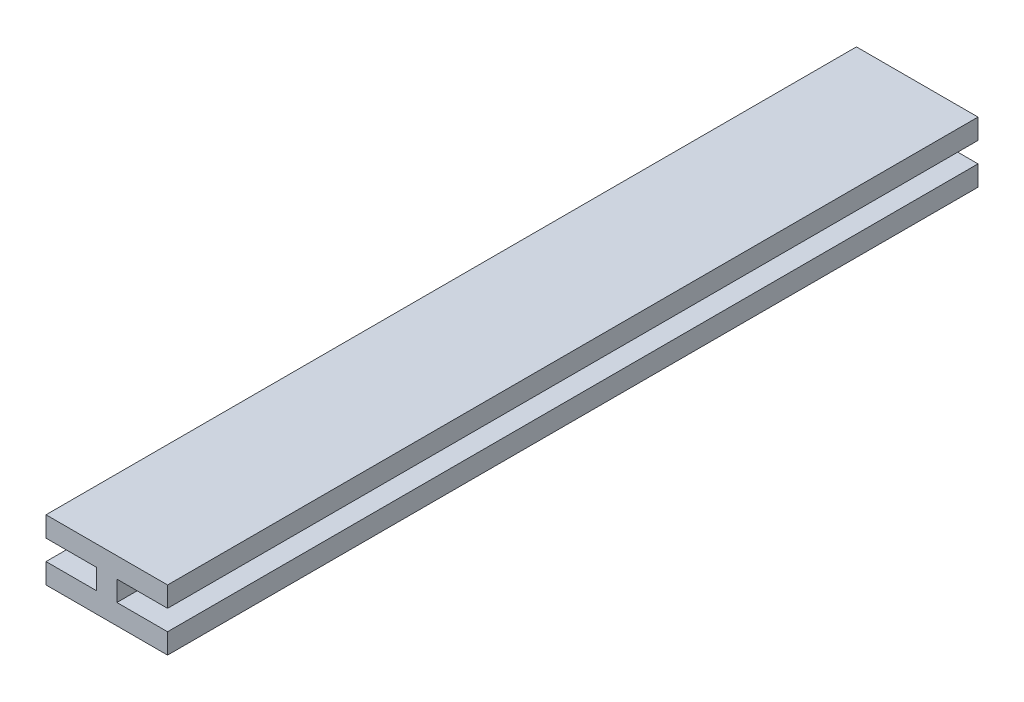
ISO-10303-21;
HEADER;
FILE_DESCRIPTION(('STEP AP214'),'2;1');
FILE_NAME('part.step','',(''),(''),'','','');
FILE_SCHEMA(('AUTOMOTIVE_DESIGN { 1 0 10303 214 1 1 1 1 }'));
ENDSEC;
DATA;
#1=APPLICATION_CONTEXT('core data for automotive mechanical design processes');
#2=APPLICATION_PROTOCOL_DEFINITION('international standard','automotive_design',2000,#1);
#3=PRODUCT_CONTEXT('',#1,'mechanical');
#4=PRODUCT('Part','Part','',(#3));
#5=PRODUCT_RELATED_PRODUCT_CATEGORY('part','',(#4));
#6=PRODUCT_DEFINITION_FORMATION('','',#4);
#7=PRODUCT_DEFINITION_CONTEXT('part definition',#1,'design');
#8=PRODUCT_DEFINITION('design','',#6,#7);
#9=PRODUCT_DEFINITION_SHAPE('','',#8);
#10=(LENGTH_UNIT() NAMED_UNIT(*) SI_UNIT(.MILLI.,.METRE.));
#11=(NAMED_UNIT(*) PLANE_ANGLE_UNIT() SI_UNIT($,.RADIAN.));
#12=(NAMED_UNIT(*) SI_UNIT($,.STERADIAN.) SOLID_ANGLE_UNIT());
#13=UNCERTAINTY_MEASURE_WITH_UNIT(LENGTH_MEASURE(1.E-05),#10,'distance_accuracy_value','');
#14=(GEOMETRIC_REPRESENTATION_CONTEXT(3) GLOBAL_UNCERTAINTY_ASSIGNED_CONTEXT((#13)) GLOBAL_UNIT_ASSIGNED_CONTEXT((#10,
#11,#12)) REPRESENTATION_CONTEXT('',''));
#15=CARTESIAN_POINT('',(0.,0.,0.));
#16=DIRECTION('',(0.,0.,1.));
#17=DIRECTION('',(1.,0.,0.));
#18=AXIS2_PLACEMENT_3D('',#15,#16,#17);
#19=CARTESIAN_POINT('',(0.,3.,0.));
#20=DIRECTION('',(0.,1.,0.));
#21=DIRECTION('',(0.,0.,1.));
#22=AXIS2_PLACEMENT_3D('',#19,#20,#21);
#23=PLANE('',#22);
#24=DIRECTION('',(0.,0.,1.));
#25=VECTOR('',#24,1.);
#26=CARTESIAN_POINT('',(-1.5,3.,60.));
#27=LINE('',#26,#25);
#28=CARTESIAN_POINT('',(-1.5,3.,-60.));
#29=VERTEX_POINT('',#28);
#30=CARTESIAN_POINT('',(-1.5,3.,60.));
#31=VERTEX_POINT('',#30);
#32=EDGE_CURVE('E153',#29,#31,#27,.T.);
#33=ORIENTED_EDGE('',*,*,#32,.F.);
#34=DIRECTION('',(-1.,0.,0.));
#35=VECTOR('',#34,1.);
#36=CARTESIAN_POINT('',(9.,3.,-60.));
#37=LINE('',#36,#35);
#38=CARTESIAN_POINT('',(-9.,3.,-60.));
#39=VERTEX_POINT('',#38);
#40=EDGE_CURVE('E248',#29,#39,#37,.T.);
#41=ORIENTED_EDGE('',*,*,#40,.T.);
#42=DIRECTION('',(0.,0.,-1.));
#43=VECTOR('',#42,1.);
#44=CARTESIAN_POINT('',(-9.,3.,60.));
#45=LINE('',#44,#43);
#46=CARTESIAN_POINT('',(-9.,3.,60.));
#47=VERTEX_POINT('',#46);
#48=EDGE_CURVE('E224',#47,#39,#45,.T.);
#49=ORIENTED_EDGE('',*,*,#48,.F.);
#50=DIRECTION('',(-1.,0.,0.));
#51=VECTOR('',#50,1.);
#52=CARTESIAN_POINT('',(9.,3.,60.));
#53=LINE('',#52,#51);
#54=EDGE_CURVE('E51',#31,#47,#53,.T.);
#55=ORIENTED_EDGE('',*,*,#54,.F.);
#56=EDGE_LOOP('',(#33,#41,#49,#55));
#57=FACE_BOUND('',#56,.T.);
#58=ADVANCED_FACE('F33',(#57),#23,.T.);
#59=CARTESIAN_POINT('',(9.,3.,60.));
#60=DIRECTION('',(-1.,0.,0.));
#61=DIRECTION('',(0.,0.,1.));
#62=AXIS2_PLACEMENT_3D('',#59,#60,#61);
#63=PLANE('',#62);
#64=DIRECTION('',(0.,0.,-1.));
#65=VECTOR('',#64,1.);
#66=CARTESIAN_POINT('',(9.,0.,60.));
#67=LINE('',#66,#65);
#68=CARTESIAN_POINT('',(9.,0.,60.));
#69=VERTEX_POINT('',#68);
#70=CARTESIAN_POINT('',(9.,0.,-60.));
#71=VERTEX_POINT('',#70);
#72=EDGE_CURVE('E212',#69,#71,#67,.T.);
#73=ORIENTED_EDGE('',*,*,#72,.T.);
#74=DIRECTION('',(0.,-1.,0.));
#75=VECTOR('',#74,1.);
#76=CARTESIAN_POINT('',(9.,3.,-60.));
#77=LINE('',#76,#75);
#78=CARTESIAN_POINT('',(9.,3.,-60.));
#79=VERTEX_POINT('',#78);
#80=EDGE_CURVE('E11',#79,#71,#77,.T.);
#81=ORIENTED_EDGE('',*,*,#80,.F.);
#82=DIRECTION('',(0.,0.,-1.));
#83=VECTOR('',#82,1.);
#84=CARTESIAN_POINT('',(9.,3.,60.));
#85=LINE('',#84,#83);
#86=CARTESIAN_POINT('',(9.,3.,60.));
#87=VERTEX_POINT('',#86);
#88=EDGE_CURVE('E241',#87,#79,#85,.T.);
#89=ORIENTED_EDGE('',*,*,#88,.F.);
#90=DIRECTION('',(0.,-1.,0.));
#91=VECTOR('',#90,1.);
#92=CARTESIAN_POINT('',(9.,3.,60.));
#93=LINE('',#92,#91);
#94=EDGE_CURVE('E242',#87,#69,#93,.T.);
#95=ORIENTED_EDGE('',*,*,#94,.T.);
#96=EDGE_LOOP('',(#73,#81,#89,#95));
#97=FACE_BOUND('',#96,.T.);
#98=ADVANCED_FACE('F35',(#97),#63,.F.);
#99=CARTESIAN_POINT('',(9.,3.,-60.));
#100=DIRECTION('',(0.,0.,1.));
#101=DIRECTION('',(1.,0.,0.));
#102=AXIS2_PLACEMENT_3D('',#99,#100,#101);
#103=PLANE('',#102);
#104=DIRECTION('',(-1.,0.,0.));
#105=VECTOR('',#104,1.);
#106=CARTESIAN_POINT('',(9.,0.,-60.));
#107=LINE('',#106,#105);
#108=CARTESIAN_POINT('',(-9.,0.,-60.));
#109=VERTEX_POINT('',#108);
#110=EDGE_CURVE('E233',#71,#109,#107,.T.);
#111=ORIENTED_EDGE('',*,*,#110,.T.);
#112=DIRECTION('',(0.,-1.,0.));
#113=VECTOR('',#112,1.);
#114=CARTESIAN_POINT('',(-9.,3.,-60.));
#115=LINE('',#114,#113);
#116=EDGE_CURVE('E43',#39,#109,#115,.T.);
#117=ORIENTED_EDGE('',*,*,#116,.F.);
#118=ORIENTED_EDGE('',*,*,#40,.F.);
#119=DIRECTION('',(0.,-1.,0.));
#120=VECTOR('',#119,1.);
#121=CARTESIAN_POINT('',(-1.5,6.,-60.));
#122=LINE('',#121,#120);
#123=CARTESIAN_POINT('',(-1.5,6.,-60.));
#124=VERTEX_POINT('',#123);
#125=EDGE_CURVE('E191',#124,#29,#122,.T.);
#126=ORIENTED_EDGE('',*,*,#125,.F.);
#127=DIRECTION('',(-1.,0.,0.));
#128=VECTOR('',#127,1.);
#129=CARTESIAN_POINT('',(9.,6.,-60.));
#130=LINE('',#129,#128);
#131=CARTESIAN_POINT('',(-9.,6.,-60.));
#132=VERTEX_POINT('',#131);
#133=EDGE_CURVE('E164',#124,#132,#130,.T.);
#134=ORIENTED_EDGE('',*,*,#133,.T.);
#135=DIRECTION('',(0.,-1.,0.));
#136=VECTOR('',#135,1.);
#137=CARTESIAN_POINT('',(-9.,9.,-60.));
#138=LINE('',#137,#136);
#139=CARTESIAN_POINT('',(-9.,9.,-60.));
#140=VERTEX_POINT('',#139);
#141=EDGE_CURVE('E171',#140,#132,#138,.T.);
#142=ORIENTED_EDGE('',*,*,#141,.F.);
#143=DIRECTION('',(-1.,0.,0.));
#144=VECTOR('',#143,1.);
#145=CARTESIAN_POINT('',(9.,9.,-60.));
#146=LINE('',#145,#144);
#147=CARTESIAN_POINT('',(9.,9.,-60.));
#148=VERTEX_POINT('',#147);
#149=EDGE_CURVE('E144',#148,#140,#146,.T.);
#150=ORIENTED_EDGE('',*,*,#149,.F.);
#151=DIRECTION('',(0.,-1.,0.));
#152=VECTOR('',#151,1.);
#153=CARTESIAN_POINT('',(9.,9.,-60.));
#154=LINE('',#153,#152);
#155=CARTESIAN_POINT('',(9.,6.,-60.));
#156=VERTEX_POINT('',#155);
#157=EDGE_CURVE('E157',#148,#156,#154,.T.);
#158=ORIENTED_EDGE('',*,*,#157,.T.);
#159=CARTESIAN_POINT('',(1.5,6.,-60.));
#160=VERTEX_POINT('',#159);
#161=EDGE_CURVE('E148',#156,#160,#130,.T.);
#162=ORIENTED_EDGE('',*,*,#161,.T.);
#163=DIRECTION('',(0.,-1.,0.));
#164=VECTOR('',#163,1.);
#165=CARTESIAN_POINT('',(1.5,6.,-60.));
#166=LINE('',#165,#164);
#167=CARTESIAN_POINT('',(1.5,3.,-60.));
#168=VERTEX_POINT('',#167);
#169=EDGE_CURVE('E193',#160,#168,#166,.T.);
#170=ORIENTED_EDGE('',*,*,#169,.T.);
#171=EDGE_CURVE('E247',#79,#168,#37,.T.);
#172=ORIENTED_EDGE('',*,*,#171,.F.);
#173=ORIENTED_EDGE('',*,*,#80,.T.);
#174=EDGE_LOOP('',(#111,#117,#118,#126,#134,#142,#150,#158,#162,#170,#172,#173));
#175=FACE_BOUND('',#174,.T.);
#176=ADVANCED_FACE('F178',(#175),#103,.F.);
#177=CARTESIAN_POINT('',(-9.,3.,60.));
#178=DIRECTION('',(-1.,0.,0.));
#179=DIRECTION('',(0.,0.,1.));
#180=AXIS2_PLACEMENT_3D('',#177,#178,#179);
#181=PLANE('',#180);
#182=DIRECTION('',(0.,0.,-1.));
#183=VECTOR('',#182,1.);
#184=CARTESIAN_POINT('',(-9.,0.,60.));
#185=LINE('',#184,#183);
#186=CARTESIAN_POINT('',(-9.,0.,60.));
#187=VERTEX_POINT('',#186);
#188=EDGE_CURVE('E235',#187,#109,#185,.T.);
#189=ORIENTED_EDGE('',*,*,#188,.F.);
#190=DIRECTION('',(0.,-1.,0.));
#191=VECTOR('',#190,1.);
#192=CARTESIAN_POINT('',(-9.,3.,60.));
#193=LINE('',#192,#191);
#194=EDGE_CURVE('E244',#47,#187,#193,.T.);
#195=ORIENTED_EDGE('',*,*,#194,.F.);
#196=ORIENTED_EDGE('',*,*,#48,.T.);
#197=ORIENTED_EDGE('',*,*,#116,.T.);
#198=EDGE_LOOP('',(#189,#195,#196,#197));
#199=FACE_BOUND('',#198,.T.);
#200=ADVANCED_FACE('F260',(#199),#181,.T.);
#201=CARTESIAN_POINT('',(9.,3.,60.));
#202=DIRECTION('',(0.,0.,1.));
#203=DIRECTION('',(1.,0.,0.));
#204=AXIS2_PLACEMENT_3D('',#201,#202,#203);
#205=PLANE('',#204);
#206=DIRECTION('',(-1.,0.,0.));
#207=VECTOR('',#206,1.);
#208=CARTESIAN_POINT('',(9.,0.,60.));
#209=LINE('',#208,#207);
#210=EDGE_CURVE('E238',#69,#187,#209,.T.);
#211=ORIENTED_EDGE('',*,*,#210,.F.);
#212=ORIENTED_EDGE('',*,*,#94,.F.);
#213=CARTESIAN_POINT('',(1.5,3.,60.));
#214=VERTEX_POINT('',#213);
#215=EDGE_CURVE('E223',#87,#214,#53,.T.);
#216=ORIENTED_EDGE('',*,*,#215,.T.);
#217=DIRECTION('',(0.,-1.,0.));
#218=VECTOR('',#217,1.);
#219=CARTESIAN_POINT('',(1.5,6.,60.));
#220=LINE('',#219,#218);
#221=CARTESIAN_POINT('',(1.5,6.,60.));
#222=VERTEX_POINT('',#221);
#223=EDGE_CURVE('E213',#222,#214,#220,.T.);
#224=ORIENTED_EDGE('',*,*,#223,.F.);
#225=DIRECTION('',(1.,0.,0.));
#226=VECTOR('',#225,1.);
#227=CARTESIAN_POINT('',(9.,6.,60.));
#228=LINE('',#227,#226);
#229=CARTESIAN_POINT('',(9.,6.,60.));
#230=VERTEX_POINT('',#229);
#231=EDGE_CURVE('E188',#222,#230,#228,.T.);
#232=ORIENTED_EDGE('',*,*,#231,.T.);
#233=DIRECTION('',(0.,-1.,0.));
#234=VECTOR('',#233,1.);
#235=CARTESIAN_POINT('',(9.,9.,60.));
#236=LINE('',#235,#234);
#237=CARTESIAN_POINT('',(9.,9.,60.));
#238=VERTEX_POINT('',#237);
#239=EDGE_CURVE('E135',#238,#230,#236,.T.);
#240=ORIENTED_EDGE('',*,*,#239,.F.);
#241=DIRECTION('',(1.,0.,0.));
#242=VECTOR('',#241,1.);
#243=CARTESIAN_POINT('',(9.,9.,60.));
#244=LINE('',#243,#242);
#245=CARTESIAN_POINT('',(-9.,9.,60.));
#246=VERTEX_POINT('',#245);
#247=EDGE_CURVE('E126',#246,#238,#244,.T.);
#248=ORIENTED_EDGE('',*,*,#247,.F.);
#249=DIRECTION('',(0.,-1.,0.));
#250=VECTOR('',#249,1.);
#251=CARTESIAN_POINT('',(-9.,9.,60.));
#252=LINE('',#251,#250);
#253=CARTESIAN_POINT('',(-9.,6.,60.));
#254=VERTEX_POINT('',#253);
#255=EDGE_CURVE('E132',#246,#254,#252,.T.);
#256=ORIENTED_EDGE('',*,*,#255,.T.);
#257=CARTESIAN_POINT('',(-1.5,6.,60.));
#258=VERTEX_POINT('',#257);
#259=EDGE_CURVE('E261',#254,#258,#228,.T.);
#260=ORIENTED_EDGE('',*,*,#259,.T.);
#261=DIRECTION('',(0.,-1.,0.));
#262=VECTOR('',#261,1.);
#263=CARTESIAN_POINT('',(-1.5,6.,60.));
#264=LINE('',#263,#262);
#265=EDGE_CURVE('E210',#258,#31,#264,.T.);
#266=ORIENTED_EDGE('',*,*,#265,.T.);
#267=ORIENTED_EDGE('',*,*,#54,.T.);
#268=ORIENTED_EDGE('',*,*,#194,.T.);
#269=EDGE_LOOP('',(#211,#212,#216,#224,#232,#240,#248,#256,#260,#266,#267,#268));
#270=FACE_BOUND('',#269,.T.);
#271=ADVANCED_FACE('F129',(#270),#205,.T.);
#272=DIRECTION('',(0.,0.,-1.));
#273=VECTOR('',#272,1.);
#274=CARTESIAN_POINT('',(1.5,3.,60.));
#275=LINE('',#274,#273);
#276=EDGE_CURVE('E59',#214,#168,#275,.T.);
#277=ORIENTED_EDGE('',*,*,#276,.F.);
#278=ORIENTED_EDGE('',*,*,#215,.F.);
#279=ORIENTED_EDGE('',*,*,#88,.T.);
#280=ORIENTED_EDGE('',*,*,#171,.T.);
#281=EDGE_LOOP('',(#277,#278,#279,#280));
#282=FACE_BOUND('',#281,.T.);
#283=ADVANCED_FACE('F285',(#282),#23,.T.);
#284=CARTESIAN_POINT('',(0.,0.,0.));
#285=DIRECTION('',(0.,1.,0.));
#286=DIRECTION('',(0.,0.,1.));
#287=AXIS2_PLACEMENT_3D('',#284,#285,#286);
#288=PLANE('',#287);
#289=ORIENTED_EDGE('',*,*,#72,.F.);
#290=ORIENTED_EDGE('',*,*,#210,.T.);
#291=ORIENTED_EDGE('',*,*,#188,.T.);
#292=ORIENTED_EDGE('',*,*,#110,.F.);
#293=EDGE_LOOP('',(#289,#290,#291,#292));
#294=FACE_BOUND('',#293,.T.);
#295=ADVANCED_FACE('F293',(#294),#288,.F.);
#296=CARTESIAN_POINT('',(-1.5,6.,60.));
#297=DIRECTION('',(1.,0.,0.));
#298=DIRECTION('',(0.,0.,-1.));
#299=AXIS2_PLACEMENT_3D('',#296,#297,#298);
#300=PLANE('',#299);
#301=ORIENTED_EDGE('',*,*,#32,.T.);
#302=ORIENTED_EDGE('',*,*,#265,.F.);
#303=DIRECTION('',(0.,0.,1.));
#304=VECTOR('',#303,1.);
#305=CARTESIAN_POINT('',(-1.5,6.,60.));
#306=LINE('',#305,#304);
#307=EDGE_CURVE('E37',#124,#258,#306,.T.);
#308=ORIENTED_EDGE('',*,*,#307,.F.);
#309=ORIENTED_EDGE('',*,*,#125,.T.);
#310=EDGE_LOOP('',(#301,#302,#308,#309));
#311=FACE_BOUND('',#310,.T.);
#312=ADVANCED_FACE('F264',(#311),#300,.F.);
#313=CARTESIAN_POINT('',(1.5,6.,60.));
#314=DIRECTION('',(-1.,0.,0.));
#315=DIRECTION('',(0.,0.,1.));
#316=AXIS2_PLACEMENT_3D('',#313,#314,#315);
#317=PLANE('',#316);
#318=ORIENTED_EDGE('',*,*,#276,.T.);
#319=ORIENTED_EDGE('',*,*,#169,.F.);
#320=DIRECTION('',(0.,0.,-1.));
#321=VECTOR('',#320,1.);
#322=CARTESIAN_POINT('',(1.5,6.,60.));
#323=LINE('',#322,#321);
#324=EDGE_CURVE('E187',#222,#160,#323,.T.);
#325=ORIENTED_EDGE('',*,*,#324,.F.);
#326=ORIENTED_EDGE('',*,*,#223,.T.);
#327=EDGE_LOOP('',(#318,#319,#325,#326));
#328=FACE_BOUND('',#327,.T.);
#329=ADVANCED_FACE('F353',(#328),#317,.F.);
#330=CARTESIAN_POINT('',(0.,6.,0.));
#331=DIRECTION('',(0.,1.,0.));
#332=DIRECTION('',(0.,0.,1.));
#333=AXIS2_PLACEMENT_3D('',#330,#331,#332);
#334=PLANE('',#333);
#335=ORIENTED_EDGE('',*,*,#133,.F.);
#336=ORIENTED_EDGE('',*,*,#307,.T.);
#337=ORIENTED_EDGE('',*,*,#259,.F.);
#338=DIRECTION('',(0.,0.,1.));
#339=VECTOR('',#338,1.);
#340=CARTESIAN_POINT('',(-9.,6.,60.));
#341=LINE('',#340,#339);
#342=EDGE_CURVE('E152',#132,#254,#341,.T.);
#343=ORIENTED_EDGE('',*,*,#342,.F.);
#344=EDGE_LOOP('',(#335,#336,#337,#343));
#345=FACE_BOUND('',#344,.T.);
#346=ADVANCED_FACE('F267',(#345),#334,.F.);
#347=ORIENTED_EDGE('',*,*,#231,.F.);
#348=ORIENTED_EDGE('',*,*,#324,.T.);
#349=ORIENTED_EDGE('',*,*,#161,.F.);
#350=DIRECTION('',(0.,0.,-1.));
#351=VECTOR('',#350,1.);
#352=CARTESIAN_POINT('',(9.,6.,60.));
#353=LINE('',#352,#351);
#354=EDGE_CURVE('E169',#230,#156,#353,.T.);
#355=ORIENTED_EDGE('',*,*,#354,.F.);
#356=EDGE_LOOP('',(#347,#348,#349,#355));
#357=FACE_BOUND('',#356,.T.);
#358=ADVANCED_FACE('F185',(#357),#334,.F.);
#359=CARTESIAN_POINT('',(-9.,9.,60.));
#360=DIRECTION('',(1.,0.,0.));
#361=DIRECTION('',(0.,0.,-1.));
#362=AXIS2_PLACEMENT_3D('',#359,#360,#361);
#363=PLANE('',#362);
#364=ORIENTED_EDGE('',*,*,#342,.T.);
#365=ORIENTED_EDGE('',*,*,#255,.F.);
#366=DIRECTION('',(0.,0.,1.));
#367=VECTOR('',#366,1.);
#368=CARTESIAN_POINT('',(-9.,9.,60.));
#369=LINE('',#368,#367);
#370=EDGE_CURVE('E139',#140,#246,#369,.T.);
#371=ORIENTED_EDGE('',*,*,#370,.F.);
#372=ORIENTED_EDGE('',*,*,#141,.T.);
#373=EDGE_LOOP('',(#364,#365,#371,#372));
#374=FACE_BOUND('',#373,.T.);
#375=ADVANCED_FACE('F150',(#374),#363,.F.);
#376=CARTESIAN_POINT('',(9.,9.,60.));
#377=DIRECTION('',(-1.,0.,0.));
#378=DIRECTION('',(0.,0.,1.));
#379=AXIS2_PLACEMENT_3D('',#376,#377,#378);
#380=PLANE('',#379);
#381=ORIENTED_EDGE('',*,*,#354,.T.);
#382=ORIENTED_EDGE('',*,*,#157,.F.);
#383=DIRECTION('',(0.,0.,-1.));
#384=VECTOR('',#383,1.);
#385=CARTESIAN_POINT('',(9.,9.,60.));
#386=LINE('',#385,#384);
#387=EDGE_CURVE('E138',#238,#148,#386,.T.);
#388=ORIENTED_EDGE('',*,*,#387,.F.);
#389=ORIENTED_EDGE('',*,*,#239,.T.);
#390=EDGE_LOOP('',(#381,#382,#388,#389));
#391=FACE_BOUND('',#390,.T.);
#392=ADVANCED_FACE('F273',(#391),#380,.F.);
#393=CARTESIAN_POINT('',(0.,9.,0.));
#394=DIRECTION('',(0.,1.,0.));
#395=DIRECTION('',(0.,0.,1.));
#396=AXIS2_PLACEMENT_3D('',#393,#394,#395);
#397=PLANE('',#396);
#398=ORIENTED_EDGE('',*,*,#370,.T.);
#399=ORIENTED_EDGE('',*,*,#247,.T.);
#400=ORIENTED_EDGE('',*,*,#387,.T.);
#401=ORIENTED_EDGE('',*,*,#149,.T.);
#402=EDGE_LOOP('',(#398,#399,#400,#401));
#403=FACE_BOUND('',#402,.T.);
#404=ADVANCED_FACE('F142',(#403),#397,.T.);
#405=CLOSED_SHELL('',(#58,#98,#176,#200,#271,#283,#295,#312,#329,#346,#358,#375,#392,#404));
#406=MANIFOLD_SOLID_BREP('B2',#405);
#407=ADVANCED_BREP_SHAPE_REPRESENTATION('',(#18,#406),#14);
#408=SHAPE_DEFINITION_REPRESENTATION(#9,#407);
ENDSEC;
END-ISO-10303-21;
